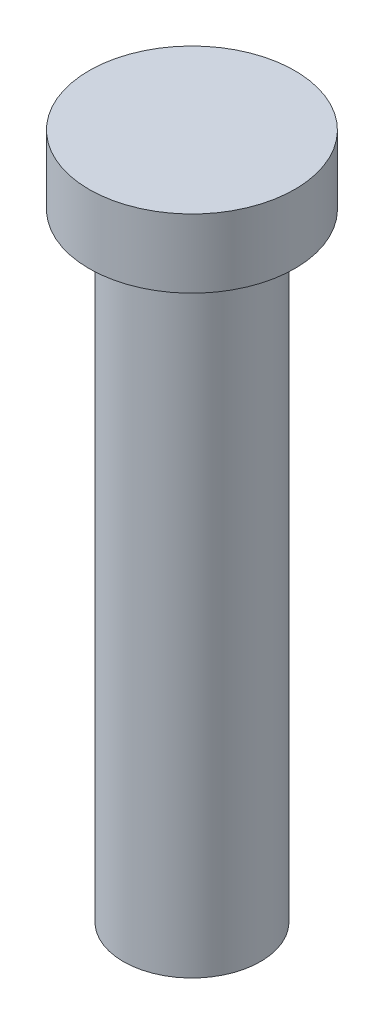
ISO-10303-21;
HEADER;
FILE_DESCRIPTION(('STEP AP214'),'2;1');
FILE_NAME('part.step','',(''),(''),'','','');
FILE_SCHEMA(('AUTOMOTIVE_DESIGN { 1 0 10303 214 1 1 1 1 }'));
ENDSEC;
DATA;
#1=APPLICATION_CONTEXT('core data for automotive mechanical design processes');
#2=APPLICATION_PROTOCOL_DEFINITION('international standard','automotive_design',2000,#1);
#3=PRODUCT_CONTEXT('',#1,'mechanical');
#4=PRODUCT('Part','Part','',(#3));
#5=PRODUCT_RELATED_PRODUCT_CATEGORY('part','',(#4));
#6=PRODUCT_DEFINITION_FORMATION('','',#4);
#7=PRODUCT_DEFINITION_CONTEXT('part definition',#1,'design');
#8=PRODUCT_DEFINITION('design','',#6,#7);
#9=PRODUCT_DEFINITION_SHAPE('','',#8);
#10=(LENGTH_UNIT() NAMED_UNIT(*) SI_UNIT(.MILLI.,.METRE.));
#11=(NAMED_UNIT(*) PLANE_ANGLE_UNIT() SI_UNIT($,.RADIAN.));
#12=(NAMED_UNIT(*) SI_UNIT($,.STERADIAN.) SOLID_ANGLE_UNIT());
#13=UNCERTAINTY_MEASURE_WITH_UNIT(LENGTH_MEASURE(1.E-05),#10,'distance_accuracy_value','');
#14=(GEOMETRIC_REPRESENTATION_CONTEXT(3) GLOBAL_UNCERTAINTY_ASSIGNED_CONTEXT((#13)) GLOBAL_UNIT_ASSIGNED_CONTEXT((#10,
#11,#12)) REPRESENTATION_CONTEXT('',''));
#15=CARTESIAN_POINT('',(0.,0.,0.));
#16=DIRECTION('',(0.,0.,1.));
#17=DIRECTION('',(1.,0.,0.));
#18=AXIS2_PLACEMENT_3D('',#15,#16,#17);
#19=CARTESIAN_POINT('',(0.,9.,0.));
#20=DIRECTION('',(0.,-1.,0.));
#21=DIRECTION('',(0.,0.,-1.));
#22=AXIS2_PLACEMENT_3D('',#19,#20,#21);
#23=CYLINDRICAL_SURFACE('',#22,1.);
#24=CARTESIAN_POINT('',(0.,9.,0.));
#25=DIRECTION('',(0.,1.,0.));
#26=DIRECTION('',(0.,0.,1.));
#27=AXIS2_PLACEMENT_3D('',#24,#25,#26);
#28=CIRCLE('',#27,1.);
#29=CARTESIAN_POINT('',(0.,9.,1.));
#30=VERTEX_POINT('',#29);
#31=EDGE_CURVE('E10',#30,#30,#28,.T.);
#32=ORIENTED_EDGE('',*,*,#31,.F.);
#33=EDGE_LOOP('',(#32));
#34=FACE_BOUND('',#33,.T.);
#35=CARTESIAN_POINT('',(0.,0.,0.));
#36=DIRECTION('',(0.,1.,0.));
#37=DIRECTION('',(0.,0.,1.));
#38=AXIS2_PLACEMENT_3D('',#35,#36,#37);
#39=CIRCLE('',#38,1.);
#40=CARTESIAN_POINT('',(0.,0.,1.));
#41=VERTEX_POINT('',#40);
#42=EDGE_CURVE('E34',#41,#41,#39,.T.);
#43=ORIENTED_EDGE('',*,*,#42,.T.);
#44=EDGE_LOOP('',(#43));
#45=FACE_BOUND('',#44,.T.);
#46=ADVANCED_FACE('F31',(#34,#45),#23,.T.);
#47=CARTESIAN_POINT('',(0.,0.,0.));
#48=DIRECTION('',(0.,1.,0.));
#49=DIRECTION('',(0.,0.,1.));
#50=AXIS2_PLACEMENT_3D('',#47,#48,#49);
#51=PLANE('',#50);
#52=ORIENTED_EDGE('',*,*,#42,.F.);
#53=EDGE_LOOP('',(#52));
#54=FACE_BOUND('',#53,.T.);
#55=ADVANCED_FACE('F54',(#54),#51,.F.);
#56=CARTESIAN_POINT('',(0.,10.,0.));
#57=DIRECTION('',(0.,-1.,0.));
#58=DIRECTION('',(0.,0.,-1.));
#59=AXIS2_PLACEMENT_3D('',#56,#57,#58);
#60=CYLINDRICAL_SURFACE('',#59,1.5);
#61=CARTESIAN_POINT('',(0.,10.,0.));
#62=DIRECTION('',(0.,1.,0.));
#63=DIRECTION('',(0.,0.,1.));
#64=AXIS2_PLACEMENT_3D('',#61,#62,#63);
#65=CIRCLE('',#64,1.5);
#66=CARTESIAN_POINT('',(0.,10.,1.5));
#67=VERTEX_POINT('',#66);
#68=EDGE_CURVE('E41',#67,#67,#65,.T.);
#69=ORIENTED_EDGE('',*,*,#68,.F.);
#70=EDGE_LOOP('',(#69));
#71=FACE_BOUND('',#70,.T.);
#72=CARTESIAN_POINT('',(0.,9.,0.));
#73=DIRECTION('',(0.,1.,0.));
#74=DIRECTION('',(0.,0.,1.));
#75=AXIS2_PLACEMENT_3D('',#72,#73,#74);
#76=CIRCLE('',#75,1.5);
#77=CARTESIAN_POINT('',(0.,9.,1.5));
#78=VERTEX_POINT('',#77);
#79=EDGE_CURVE('E43',#78,#78,#76,.T.);
#80=ORIENTED_EDGE('',*,*,#79,.T.);
#81=EDGE_LOOP('',(#80));
#82=FACE_BOUND('',#81,.T.);
#83=ADVANCED_FACE('F51',(#71,#82),#60,.T.);
#84=CARTESIAN_POINT('',(0.,10.,0.));
#85=DIRECTION('',(0.,1.,0.));
#86=DIRECTION('',(0.,0.,1.));
#87=AXIS2_PLACEMENT_3D('',#84,#85,#86);
#88=PLANE('',#87);
#89=ORIENTED_EDGE('',*,*,#68,.T.);
#90=EDGE_LOOP('',(#89));
#91=FACE_BOUND('',#90,.T.);
#92=ADVANCED_FACE('F49',(#91),#88,.T.);
#93=CARTESIAN_POINT('',(0.,9.,0.));
#94=DIRECTION('',(0.,1.,0.));
#95=DIRECTION('',(0.,0.,1.));
#96=AXIS2_PLACEMENT_3D('',#93,#94,#95);
#97=PLANE('',#96);
#98=ORIENTED_EDGE('',*,*,#31,.T.);
#99=EDGE_LOOP('',(#98));
#100=FACE_BOUND('',#99,.T.);
#101=ORIENTED_EDGE('',*,*,#79,.F.);
#102=EDGE_LOOP('',(#101));
#103=FACE_BOUND('',#102,.T.);
#104=ADVANCED_FACE('F58',(#100,#103),#97,.F.);
#105=CLOSED_SHELL('',(#46,#55,#83,#92,#104));
#106=MANIFOLD_SOLID_BREP('B2',#105);
#107=ADVANCED_BREP_SHAPE_REPRESENTATION('',(#18,#106),#14);
#108=SHAPE_DEFINITION_REPRESENTATION(#9,#107);
ENDSEC;
END-ISO-10303-21;
